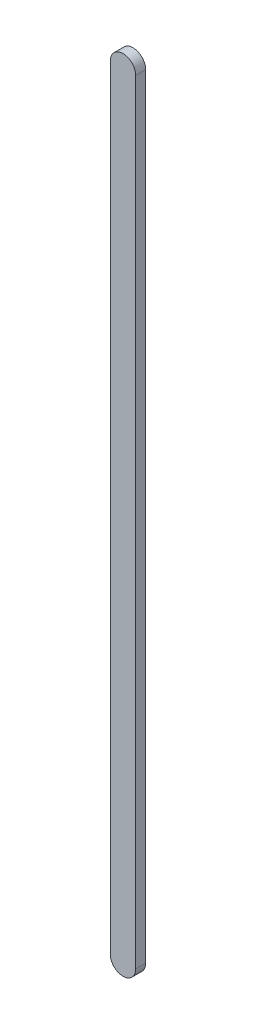
ISO-10303-21;
HEADER;
FILE_DESCRIPTION(('STEP AP214'),'2;1');
FILE_NAME('part.step','',(''),(''),'','','');
FILE_SCHEMA(('AUTOMOTIVE_DESIGN { 1 0 10303 214 1 1 1 1 }'));
ENDSEC;
DATA;
#1=APPLICATION_CONTEXT('core data for automotive mechanical design processes');
#2=APPLICATION_PROTOCOL_DEFINITION('international standard','automotive_design',2000,#1);
#3=PRODUCT_CONTEXT('',#1,'mechanical');
#4=PRODUCT('Part','Part','',(#3));
#5=PRODUCT_RELATED_PRODUCT_CATEGORY('part','',(#4));
#6=PRODUCT_DEFINITION_FORMATION('','',#4);
#7=PRODUCT_DEFINITION_CONTEXT('part definition',#1,'design');
#8=PRODUCT_DEFINITION('design','',#6,#7);
#9=PRODUCT_DEFINITION_SHAPE('','',#8);
#10=(LENGTH_UNIT() NAMED_UNIT(*) SI_UNIT(.MILLI.,.METRE.));
#11=(NAMED_UNIT(*) PLANE_ANGLE_UNIT() SI_UNIT($,.RADIAN.));
#12=(NAMED_UNIT(*) SI_UNIT($,.STERADIAN.) SOLID_ANGLE_UNIT());
#13=UNCERTAINTY_MEASURE_WITH_UNIT(LENGTH_MEASURE(1.E-05),#10,'distance_accuracy_value','');
#14=(GEOMETRIC_REPRESENTATION_CONTEXT(3) GLOBAL_UNCERTAINTY_ASSIGNED_CONTEXT((#13)) GLOBAL_UNIT_ASSIGNED_CONTEXT((#10,
#11,#12)) REPRESENTATION_CONTEXT('',''));
#15=CARTESIAN_POINT('',(0.,0.,0.));
#16=DIRECTION('',(0.,0.,1.));
#17=DIRECTION('',(1.,0.,0.));
#18=AXIS2_PLACEMENT_3D('',#15,#16,#17);
#19=CARTESIAN_POINT('',(138.811,67.31,0.));
#20=DIRECTION('',(-1.,0.,0.));
#21=DIRECTION('',(0.,1.,0.));
#22=AXIS2_PLACEMENT_3D('',#19,#20,#21);
#23=PLANE('',#22);
#24=DIRECTION('',(0.,1.,0.));
#25=VECTOR('',#24,1.);
#26=CARTESIAN_POINT('',(138.811,67.31,0.1999996));
#27=LINE('',#26,#25);
#28=CARTESIAN_POINT('',(138.811,67.31,0.1999996));
#29=VERTEX_POINT('',#28);
#30=CARTESIAN_POINT('',(138.811,82.804,0.1999996));
#31=VERTEX_POINT('',#30);
#32=EDGE_CURVE('E11',#29,#31,#27,.T.);
#33=ORIENTED_EDGE('',*,*,#32,.F.);
#34=DIRECTION('',(0.,0.,1.));
#35=VECTOR('',#34,1.);
#36=CARTESIAN_POINT('',(138.811,67.31,0.));
#37=LINE('',#36,#35);
#38=CARTESIAN_POINT('',(138.811,67.31,0.));
#39=VERTEX_POINT('',#38);
#40=EDGE_CURVE('E24',#39,#29,#37,.T.);
#41=ORIENTED_EDGE('',*,*,#40,.F.);
#42=DIRECTION('',(0.,1.,0.));
#43=VECTOR('',#42,1.);
#44=CARTESIAN_POINT('',(138.811,67.31,0.));
#45=LINE('',#44,#43);
#46=CARTESIAN_POINT('',(138.811,82.804,0.));
#47=VERTEX_POINT('',#46);
#48=EDGE_CURVE('E75',#39,#47,#45,.T.);
#49=ORIENTED_EDGE('',*,*,#48,.T.);
#50=DIRECTION('',(0.,0.,1.));
#51=VECTOR('',#50,1.);
#52=CARTESIAN_POINT('',(138.811,82.804,0.));
#53=LINE('',#52,#51);
#54=EDGE_CURVE('E37',#47,#31,#53,.T.);
#55=ORIENTED_EDGE('',*,*,#54,.T.);
#56=EDGE_LOOP('',(#33,#41,#49,#55));
#57=FACE_BOUND('',#56,.T.);
#58=ADVANCED_FACE('F17',(#57),#23,.F.);
#59=CARTESIAN_POINT('',(138.557,82.804,0.));
#60=DIRECTION('',(0.,0.,-1.));
#61=DIRECTION('',(1.,0.,0.));
#62=AXIS2_PLACEMENT_3D('',#59,#60,#61);
#63=CYLINDRICAL_SURFACE('',#62,0.254);
#64=CARTESIAN_POINT('',(138.557,82.804,0.1999996));
#65=DIRECTION('',(0.,0.,1.));
#66=DIRECTION('',(1.,0.,0.));
#67=AXIS2_PLACEMENT_3D('',#64,#65,#66);
#68=CIRCLE('',#67,0.254);
#69=CARTESIAN_POINT('',(138.303,82.804,0.1999996));
#70=VERTEX_POINT('',#69);
#71=EDGE_CURVE('E83',#31,#70,#68,.T.);
#72=ORIENTED_EDGE('',*,*,#71,.F.);
#73=ORIENTED_EDGE('',*,*,#54,.F.);
#74=CARTESIAN_POINT('',(138.557,82.804,0.));
#75=DIRECTION('',(0.,0.,1.));
#76=DIRECTION('',(1.,0.,0.));
#77=AXIS2_PLACEMENT_3D('',#74,#75,#76);
#78=CIRCLE('',#77,0.254);
#79=CARTESIAN_POINT('',(138.303,82.804,0.));
#80=VERTEX_POINT('',#79);
#81=EDGE_CURVE('E81',#47,#80,#78,.T.);
#82=ORIENTED_EDGE('',*,*,#81,.T.);
#83=DIRECTION('',(0.,0.,1.));
#84=VECTOR('',#83,1.);
#85=CARTESIAN_POINT('',(138.303,82.804,0.));
#86=LINE('',#85,#84);
#87=EDGE_CURVE('E67',#80,#70,#86,.T.);
#88=ORIENTED_EDGE('',*,*,#87,.T.);
#89=EDGE_LOOP('',(#72,#73,#82,#88));
#90=FACE_BOUND('',#89,.T.);
#91=ADVANCED_FACE('F89',(#90),#63,.T.);
#92=CARTESIAN_POINT('',(138.303,82.804,0.));
#93=DIRECTION('',(1.,0.,0.));
#94=DIRECTION('',(0.,-1.,0.));
#95=AXIS2_PLACEMENT_3D('',#92,#93,#94);
#96=PLANE('',#95);
#97=DIRECTION('',(0.,-1.,0.));
#98=VECTOR('',#97,1.);
#99=CARTESIAN_POINT('',(138.303,82.804,0.1999996));
#100=LINE('',#99,#98);
#101=CARTESIAN_POINT('',(138.303,67.31,0.1999996));
#102=VERTEX_POINT('',#101);
#103=EDGE_CURVE('E71',#70,#102,#100,.T.);
#104=ORIENTED_EDGE('',*,*,#103,.F.);
#105=ORIENTED_EDGE('',*,*,#87,.F.);
#106=DIRECTION('',(0.,-1.,0.));
#107=VECTOR('',#106,1.);
#108=CARTESIAN_POINT('',(138.303,82.804,0.));
#109=LINE('',#108,#107);
#110=CARTESIAN_POINT('',(138.303,67.31,0.));
#111=VERTEX_POINT('',#110);
#112=EDGE_CURVE('E63',#80,#111,#109,.T.);
#113=ORIENTED_EDGE('',*,*,#112,.T.);
#114=DIRECTION('',(0.,0.,1.));
#115=VECTOR('',#114,1.);
#116=CARTESIAN_POINT('',(138.303,67.31,0.));
#117=LINE('',#116,#115);
#118=EDGE_CURVE('E53',#111,#102,#117,.T.);
#119=ORIENTED_EDGE('',*,*,#118,.T.);
#120=EDGE_LOOP('',(#104,#105,#113,#119));
#121=FACE_BOUND('',#120,.T.);
#122=ADVANCED_FACE('F66',(#121),#96,.F.);
#123=CARTESIAN_POINT('',(138.557,67.31,0.));
#124=DIRECTION('',(0.,0.,-1.));
#125=DIRECTION('',(-1.,0.,0.));
#126=AXIS2_PLACEMENT_3D('',#123,#124,#125);
#127=CYLINDRICAL_SURFACE('',#126,0.254);
#128=CARTESIAN_POINT('',(138.557,67.31,0.1999996));
#129=DIRECTION('',(0.,0.,1.));
#130=DIRECTION('',(-1.,0.,0.));
#131=AXIS2_PLACEMENT_3D('',#128,#129,#130);
#132=CIRCLE('',#131,0.254);
#133=EDGE_CURVE('E59',#102,#29,#132,.T.);
#134=ORIENTED_EDGE('',*,*,#133,.F.);
#135=ORIENTED_EDGE('',*,*,#118,.F.);
#136=CARTESIAN_POINT('',(138.557,67.31,0.));
#137=DIRECTION('',(0.,0.,1.));
#138=DIRECTION('',(-1.,0.,0.));
#139=AXIS2_PLACEMENT_3D('',#136,#137,#138);
#140=CIRCLE('',#139,0.254);
#141=EDGE_CURVE('E57',#111,#39,#140,.T.);
#142=ORIENTED_EDGE('',*,*,#141,.T.);
#143=ORIENTED_EDGE('',*,*,#40,.T.);
#144=EDGE_LOOP('',(#134,#135,#142,#143));
#145=FACE_BOUND('',#144,.T.);
#146=ADVANCED_FACE('F55',(#145),#127,.T.);
#147=CARTESIAN_POINT('',(138.811,67.31,0.));
#148=DIRECTION('',(0.,0.,-1.));
#149=DIRECTION('',(-1.,0.,0.));
#150=AXIS2_PLACEMENT_3D('',#147,#148,#149);
#151=PLANE('',#150);
#152=ORIENTED_EDGE('',*,*,#141,.F.);
#153=ORIENTED_EDGE('',*,*,#112,.F.);
#154=ORIENTED_EDGE('',*,*,#81,.F.);
#155=ORIENTED_EDGE('',*,*,#48,.F.);
#156=EDGE_LOOP('',(#152,#153,#154,#155));
#157=FACE_BOUND('',#156,.T.);
#158=ADVANCED_FACE('F74',(#157),#151,.T.);
#159=CARTESIAN_POINT('',(138.811,67.31,0.1999996));
#160=DIRECTION('',(0.,0.,-1.));
#161=DIRECTION('',(-1.,0.,0.));
#162=AXIS2_PLACEMENT_3D('',#159,#160,#161);
#163=PLANE('',#162);
#164=ORIENTED_EDGE('',*,*,#32,.T.);
#165=ORIENTED_EDGE('',*,*,#71,.T.);
#166=ORIENTED_EDGE('',*,*,#103,.T.);
#167=ORIENTED_EDGE('',*,*,#133,.T.);
#168=EDGE_LOOP('',(#164,#165,#166,#167));
#169=FACE_BOUND('',#168,.T.);
#170=ADVANCED_FACE('F91',(#169),#163,.F.);
#171=CLOSED_SHELL('',(#58,#91,#122,#146,#158,#170));
#172=MANIFOLD_SOLID_BREP('B1',#171);
#173=ADVANCED_BREP_SHAPE_REPRESENTATION('',(#18,#172),#14);
#174=SHAPE_DEFINITION_REPRESENTATION(#9,#173);
ENDSEC;
END-ISO-10303-21;
